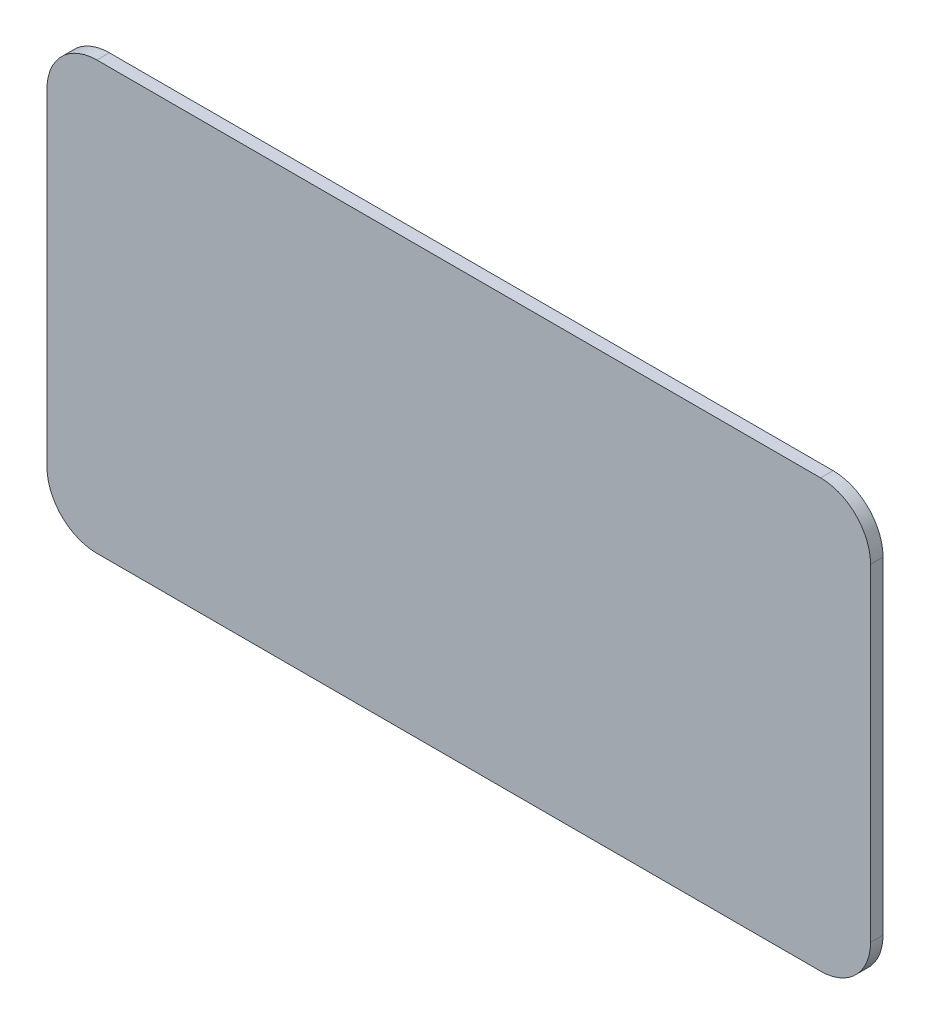
ISO-10303-21;
HEADER;
FILE_DESCRIPTION(('STEP AP214'),'2;1');
FILE_NAME('part.step','',(''),(''),'','','');
FILE_SCHEMA(('AUTOMOTIVE_DESIGN { 1 0 10303 214 1 1 1 1 }'));
ENDSEC;
DATA;
#1=APPLICATION_CONTEXT('core data for automotive mechanical design processes');
#2=APPLICATION_PROTOCOL_DEFINITION('international standard','automotive_design',2000,#1);
#3=PRODUCT_CONTEXT('',#1,'mechanical');
#4=PRODUCT('Part','Part','',(#3));
#5=PRODUCT_RELATED_PRODUCT_CATEGORY('part','',(#4));
#6=PRODUCT_DEFINITION_FORMATION('','',#4);
#7=PRODUCT_DEFINITION_CONTEXT('part definition',#1,'design');
#8=PRODUCT_DEFINITION('design','',#6,#7);
#9=PRODUCT_DEFINITION_SHAPE('','',#8);
#10=(LENGTH_UNIT() NAMED_UNIT(*) SI_UNIT(.MILLI.,.METRE.));
#11=(NAMED_UNIT(*) PLANE_ANGLE_UNIT() SI_UNIT($,.RADIAN.));
#12=(NAMED_UNIT(*) SI_UNIT($,.STERADIAN.) SOLID_ANGLE_UNIT());
#13=UNCERTAINTY_MEASURE_WITH_UNIT(LENGTH_MEASURE(1.E-05),#10,'distance_accuracy_value','');
#14=(GEOMETRIC_REPRESENTATION_CONTEXT(3) GLOBAL_UNCERTAINTY_ASSIGNED_CONTEXT((#13)) GLOBAL_UNIT_ASSIGNED_CONTEXT((#10,
#11,#12)) REPRESENTATION_CONTEXT('',''));
#15=CARTESIAN_POINT('',(0.,0.,0.));
#16=DIRECTION('',(0.,0.,1.));
#17=DIRECTION('',(1.,0.,0.));
#18=AXIS2_PLACEMENT_3D('',#15,#16,#17);
#19=CARTESIAN_POINT('',(0.,0.,6.35));
#20=DIRECTION('',(1.,0.,0.));
#21=DIRECTION('',(0.,1.,0.));
#22=AXIS2_PLACEMENT_3D('',#19,#20,#21);
#23=PLANE('',#22);
#24=DIRECTION('',(0.,-1.,0.));
#25=VECTOR('',#24,1.);
#26=CARTESIAN_POINT('',(0.,0.,0.));
#27=LINE('',#26,#25);
#28=CARTESIAN_POINT('',(0.,-25.4,0.));
#29=VERTEX_POINT('',#28);
#30=CARTESIAN_POINT('',(0.,-192.024,0.));
#31=VERTEX_POINT('',#30);
#32=EDGE_CURVE('E168',#29,#31,#27,.T.);
#33=ORIENTED_EDGE('',*,*,#32,.T.);
#34=DIRECTION('',(0.,0.,-1.));
#35=VECTOR('',#34,1.);
#36=CARTESIAN_POINT('',(0.,-192.024,6.35));
#37=LINE('',#36,#35);
#38=CARTESIAN_POINT('',(0.,-192.024,6.35));
#39=VERTEX_POINT('',#38);
#40=EDGE_CURVE('E146',#31,#39,#37,.F.);
#41=ORIENTED_EDGE('',*,*,#40,.T.);
#42=DIRECTION('',(0.,-1.,0.));
#43=VECTOR('',#42,1.);
#44=CARTESIAN_POINT('',(0.,0.,6.35));
#45=LINE('',#44,#43);
#46=CARTESIAN_POINT('',(0.,-25.4,6.35));
#47=VERTEX_POINT('',#46);
#48=EDGE_CURVE('E120',#47,#39,#45,.T.);
#49=ORIENTED_EDGE('',*,*,#48,.F.);
#50=DIRECTION('',(0.,0.,-1.));
#51=VECTOR('',#50,1.);
#52=CARTESIAN_POINT('',(0.,-25.4,6.35));
#53=LINE('',#52,#51);
#54=EDGE_CURVE('E133',#47,#29,#53,.T.);
#55=ORIENTED_EDGE('',*,*,#54,.T.);
#56=EDGE_LOOP('',(#33,#41,#49,#55));
#57=FACE_BOUND('',#56,.T.);
#58=ADVANCED_FACE('F33',(#57),#23,.F.);
#59=CARTESIAN_POINT('',(0.,-217.424,6.35));
#60=DIRECTION('',(0.,1.,0.));
#61=DIRECTION('',(0.,0.,1.));
#62=AXIS2_PLACEMENT_3D('',#59,#60,#61);
#63=PLANE('',#62);
#64=DIRECTION('',(1.,0.,0.));
#65=VECTOR('',#64,1.);
#66=CARTESIAN_POINT('',(0.,-217.424,0.));
#67=LINE('',#66,#65);
#68=CARTESIAN_POINT('',(25.4,-217.424,0.));
#69=VERTEX_POINT('',#68);
#70=CARTESIAN_POINT('',(393.7,-217.424,0.));
#71=VERTEX_POINT('',#70);
#72=EDGE_CURVE('E126',#69,#71,#67,.T.);
#73=ORIENTED_EDGE('',*,*,#72,.T.);
#74=DIRECTION('',(0.,0.,-1.));
#75=VECTOR('',#74,1.);
#76=CARTESIAN_POINT('',(393.7,-217.424,6.35));
#77=LINE('',#76,#75);
#78=CARTESIAN_POINT('',(393.7,-217.424,6.35));
#79=VERTEX_POINT('',#78);
#80=EDGE_CURVE('E41',#71,#79,#77,.F.);
#81=ORIENTED_EDGE('',*,*,#80,.T.);
#82=DIRECTION('',(1.,0.,0.));
#83=VECTOR('',#82,1.);
#84=CARTESIAN_POINT('',(0.,-217.424,6.35));
#85=LINE('',#84,#83);
#86=CARTESIAN_POINT('',(25.4,-217.424,6.35));
#87=VERTEX_POINT('',#86);
#88=EDGE_CURVE('E124',#87,#79,#85,.T.);
#89=ORIENTED_EDGE('',*,*,#88,.F.);
#90=DIRECTION('',(0.,0.,-1.));
#91=VECTOR('',#90,1.);
#92=CARTESIAN_POINT('',(25.4,-217.424,6.35));
#93=LINE('',#92,#91);
#94=EDGE_CURVE('E141',#87,#69,#93,.T.);
#95=ORIENTED_EDGE('',*,*,#94,.T.);
#96=EDGE_LOOP('',(#73,#81,#89,#95));
#97=FACE_BOUND('',#96,.T.);
#98=ADVANCED_FACE('F170',(#97),#63,.F.);
#99=CARTESIAN_POINT('',(419.1,0.,6.35));
#100=DIRECTION('',(-1.,0.,0.));
#101=DIRECTION('',(0.,0.,1.));
#102=AXIS2_PLACEMENT_3D('',#99,#100,#101);
#103=PLANE('',#102);
#104=DIRECTION('',(0.,1.,0.));
#105=VECTOR('',#104,1.);
#106=CARTESIAN_POINT('',(419.1,0.,6.35));
#107=LINE('',#106,#105);
#108=CARTESIAN_POINT('',(419.1,-192.024,6.35));
#109=VERTEX_POINT('',#108);
#110=CARTESIAN_POINT('',(419.1,-25.4,6.35));
#111=VERTEX_POINT('',#110);
#112=EDGE_CURVE('E157',#109,#111,#107,.T.);
#113=ORIENTED_EDGE('',*,*,#112,.F.);
#114=DIRECTION('',(0.,0.,-1.));
#115=VECTOR('',#114,1.);
#116=CARTESIAN_POINT('',(419.1,-192.024,6.35));
#117=LINE('',#116,#115);
#118=CARTESIAN_POINT('',(419.1,-192.024,0.));
#119=VERTEX_POINT('',#118);
#120=EDGE_CURVE('E150',#109,#119,#117,.T.);
#121=ORIENTED_EDGE('',*,*,#120,.T.);
#122=DIRECTION('',(0.,1.,0.));
#123=VECTOR('',#122,1.);
#124=CARTESIAN_POINT('',(419.1,0.,0.));
#125=LINE('',#124,#123);
#126=CARTESIAN_POINT('',(419.1,-25.4,0.));
#127=VERTEX_POINT('',#126);
#128=EDGE_CURVE('E121',#119,#127,#125,.T.);
#129=ORIENTED_EDGE('',*,*,#128,.T.);
#130=DIRECTION('',(0.,0.,-1.));
#131=VECTOR('',#130,1.);
#132=CARTESIAN_POINT('',(419.1,-25.4,6.35));
#133=LINE('',#132,#131);
#134=EDGE_CURVE('E105',#127,#111,#133,.F.);
#135=ORIENTED_EDGE('',*,*,#134,.T.);
#136=EDGE_LOOP('',(#113,#121,#129,#135));
#137=FACE_BOUND('',#136,.T.);
#138=ADVANCED_FACE('F156',(#137),#103,.F.);
#139=CARTESIAN_POINT('',(0.,0.,6.35));
#140=DIRECTION('',(0.,-1.,0.));
#141=DIRECTION('',(0.,0.,-1.));
#142=AXIS2_PLACEMENT_3D('',#139,#140,#141);
#143=PLANE('',#142);
#144=DIRECTION('',(-1.,0.,0.));
#145=VECTOR('',#144,1.);
#146=CARTESIAN_POINT('',(0.,0.,0.));
#147=LINE('',#146,#145);
#148=CARTESIAN_POINT('',(393.7,0.,0.));
#149=VERTEX_POINT('',#148);
#150=CARTESIAN_POINT('',(25.4,0.,0.));
#151=VERTEX_POINT('',#150);
#152=EDGE_CURVE('E112',#149,#151,#147,.T.);
#153=ORIENTED_EDGE('',*,*,#152,.T.);
#154=DIRECTION('',(0.,0.,-1.));
#155=VECTOR('',#154,1.);
#156=CARTESIAN_POINT('',(25.4,0.,6.35));
#157=LINE('',#156,#155);
#158=CARTESIAN_POINT('',(25.4,0.,6.35));
#159=VERTEX_POINT('',#158);
#160=EDGE_CURVE('E137',#151,#159,#157,.F.);
#161=ORIENTED_EDGE('',*,*,#160,.T.);
#162=DIRECTION('',(-1.,0.,0.));
#163=VECTOR('',#162,1.);
#164=CARTESIAN_POINT('',(0.,0.,6.35));
#165=LINE('',#164,#163);
#166=CARTESIAN_POINT('',(393.7,0.,6.35));
#167=VERTEX_POINT('',#166);
#168=EDGE_CURVE('E115',#167,#159,#165,.T.);
#169=ORIENTED_EDGE('',*,*,#168,.F.);
#170=DIRECTION('',(0.,0.,-1.));
#171=VECTOR('',#170,1.);
#172=CARTESIAN_POINT('',(393.7,0.,6.35));
#173=LINE('',#172,#171);
#174=EDGE_CURVE('E103',#167,#149,#173,.T.);
#175=ORIENTED_EDGE('',*,*,#174,.T.);
#176=EDGE_LOOP('',(#153,#161,#169,#175));
#177=FACE_BOUND('',#176,.T.);
#178=ADVANCED_FACE('F111',(#177),#143,.F.);
#179=CARTESIAN_POINT('',(0.,0.,6.35));
#180=DIRECTION('',(0.,0.,1.));
#181=DIRECTION('',(1.,0.,0.));
#182=AXIS2_PLACEMENT_3D('',#179,#180,#181);
#183=PLANE('',#182);
#184=ORIENTED_EDGE('',*,*,#88,.T.);
#185=CARTESIAN_POINT('',(393.7,-192.024,6.35));
#186=DIRECTION('',(0.,0.,1.));
#187=DIRECTION('',(1.,0.,0.));
#188=AXIS2_PLACEMENT_3D('',#185,#186,#187);
#189=CIRCLE('',#188,25.4);
#190=EDGE_CURVE('E11',#79,#109,#189,.T.);
#191=ORIENTED_EDGE('',*,*,#190,.T.);
#192=ORIENTED_EDGE('',*,*,#112,.T.);
#193=CARTESIAN_POINT('',(393.7,-25.4,6.35));
#194=DIRECTION('',(0.,0.,1.));
#195=DIRECTION('',(1.,0.,0.));
#196=AXIS2_PLACEMENT_3D('',#193,#194,#195);
#197=CIRCLE('',#196,25.4);
#198=EDGE_CURVE('E131',#111,#167,#197,.T.);
#199=ORIENTED_EDGE('',*,*,#198,.T.);
#200=ORIENTED_EDGE('',*,*,#168,.T.);
#201=CARTESIAN_POINT('',(25.4,-25.4,6.35));
#202=DIRECTION('',(0.,0.,1.));
#203=DIRECTION('',(1.,0.,0.));
#204=AXIS2_PLACEMENT_3D('',#201,#202,#203);
#205=CIRCLE('',#204,25.4);
#206=EDGE_CURVE('E139',#159,#47,#205,.T.);
#207=ORIENTED_EDGE('',*,*,#206,.T.);
#208=ORIENTED_EDGE('',*,*,#48,.T.);
#209=CARTESIAN_POINT('',(25.4,-192.024,6.35));
#210=DIRECTION('',(0.,0.,1.));
#211=DIRECTION('',(1.,0.,0.));
#212=AXIS2_PLACEMENT_3D('',#209,#210,#211);
#213=CIRCLE('',#212,25.4);
#214=EDGE_CURVE('E148',#39,#87,#213,.T.);
#215=ORIENTED_EDGE('',*,*,#214,.T.);
#216=EDGE_LOOP('',(#184,#191,#192,#199,#200,#207,#208,#215));
#217=FACE_BOUND('',#216,.T.);
#218=ADVANCED_FACE('F161',(#217),#183,.T.);
#219=CARTESIAN_POINT('',(0.,0.,0.));
#220=DIRECTION('',(0.,0.,1.));
#221=DIRECTION('',(1.,0.,0.));
#222=AXIS2_PLACEMENT_3D('',#219,#220,#221);
#223=PLANE('',#222);
#224=ORIENTED_EDGE('',*,*,#128,.F.);
#225=CARTESIAN_POINT('',(393.7,-192.024,0.));
#226=DIRECTION('',(0.,0.,1.));
#227=DIRECTION('',(1.,0.,0.));
#228=AXIS2_PLACEMENT_3D('',#225,#226,#227);
#229=CIRCLE('',#228,25.4);
#230=EDGE_CURVE('E55',#119,#71,#229,.F.);
#231=ORIENTED_EDGE('',*,*,#230,.T.);
#232=ORIENTED_EDGE('',*,*,#72,.F.);
#233=CARTESIAN_POINT('',(25.4,-192.024,0.));
#234=DIRECTION('',(0.,0.,1.));
#235=DIRECTION('',(1.,0.,0.));
#236=AXIS2_PLACEMENT_3D('',#233,#234,#235);
#237=CIRCLE('',#236,25.4);
#238=EDGE_CURVE('E144',#69,#31,#237,.F.);
#239=ORIENTED_EDGE('',*,*,#238,.T.);
#240=ORIENTED_EDGE('',*,*,#32,.F.);
#241=CARTESIAN_POINT('',(25.4,-25.4,0.));
#242=DIRECTION('',(0.,0.,1.));
#243=DIRECTION('',(1.,0.,0.));
#244=AXIS2_PLACEMENT_3D('',#241,#242,#243);
#245=CIRCLE('',#244,25.4);
#246=EDGE_CURVE('E119',#29,#151,#245,.F.);
#247=ORIENTED_EDGE('',*,*,#246,.T.);
#248=ORIENTED_EDGE('',*,*,#152,.F.);
#249=CARTESIAN_POINT('',(393.7,-25.4,0.));
#250=DIRECTION('',(0.,0.,1.));
#251=DIRECTION('',(1.,0.,0.));
#252=AXIS2_PLACEMENT_3D('',#249,#250,#251);
#253=CIRCLE('',#252,25.4);
#254=EDGE_CURVE('E99',#149,#127,#253,.F.);
#255=ORIENTED_EDGE('',*,*,#254,.T.);
#256=EDGE_LOOP('',(#224,#231,#232,#239,#240,#247,#248,#255));
#257=FACE_BOUND('',#256,.T.);
#258=ADVANCED_FACE('F117',(#257),#223,.F.);
#259=CARTESIAN_POINT('',(393.7,-25.4,6.35));
#260=DIRECTION('',(0.,0.,-1.));
#261=DIRECTION('',(-1.,0.,0.));
#262=AXIS2_PLACEMENT_3D('',#259,#260,#261);
#263=CYLINDRICAL_SURFACE('',#262,25.4);
#264=ORIENTED_EDGE('',*,*,#198,.F.);
#265=ORIENTED_EDGE('',*,*,#134,.F.);
#266=ORIENTED_EDGE('',*,*,#254,.F.);
#267=ORIENTED_EDGE('',*,*,#174,.F.);
#268=EDGE_LOOP('',(#264,#265,#266,#267));
#269=FACE_BOUND('',#268,.T.);
#270=ADVANCED_FACE('F102',(#269),#263,.T.);
#271=CARTESIAN_POINT('',(25.4,-25.4,6.35));
#272=DIRECTION('',(0.,0.,-1.));
#273=DIRECTION('',(-1.,0.,0.));
#274=AXIS2_PLACEMENT_3D('',#271,#272,#273);
#275=CYLINDRICAL_SURFACE('',#274,25.4);
#276=ORIENTED_EDGE('',*,*,#206,.F.);
#277=ORIENTED_EDGE('',*,*,#160,.F.);
#278=ORIENTED_EDGE('',*,*,#246,.F.);
#279=ORIENTED_EDGE('',*,*,#54,.F.);
#280=EDGE_LOOP('',(#276,#277,#278,#279));
#281=FACE_BOUND('',#280,.T.);
#282=ADVANCED_FACE('F178',(#281),#275,.T.);
#283=CARTESIAN_POINT('',(25.4,-192.024,6.35));
#284=DIRECTION('',(0.,0.,-1.));
#285=DIRECTION('',(-1.,0.,0.));
#286=AXIS2_PLACEMENT_3D('',#283,#284,#285);
#287=CYLINDRICAL_SURFACE('',#286,25.4);
#288=ORIENTED_EDGE('',*,*,#214,.F.);
#289=ORIENTED_EDGE('',*,*,#40,.F.);
#290=ORIENTED_EDGE('',*,*,#238,.F.);
#291=ORIENTED_EDGE('',*,*,#94,.F.);
#292=EDGE_LOOP('',(#288,#289,#290,#291));
#293=FACE_BOUND('',#292,.T.);
#294=ADVANCED_FACE('F176',(#293),#287,.T.);
#295=CARTESIAN_POINT('',(393.7,-192.024,6.35));
#296=DIRECTION('',(0.,0.,-1.));
#297=DIRECTION('',(-1.,0.,0.));
#298=AXIS2_PLACEMENT_3D('',#295,#296,#297);
#299=CYLINDRICAL_SURFACE('',#298,25.4);
#300=ORIENTED_EDGE('',*,*,#190,.F.);
#301=ORIENTED_EDGE('',*,*,#80,.F.);
#302=ORIENTED_EDGE('',*,*,#230,.F.);
#303=ORIENTED_EDGE('',*,*,#120,.F.);
#304=EDGE_LOOP('',(#300,#301,#302,#303));
#305=FACE_BOUND('',#304,.T.);
#306=ADVANCED_FACE('F35',(#305),#299,.T.);
#307=CLOSED_SHELL('',(#58,#98,#138,#178,#218,#258,#270,#282,#294,#306));
#308=MANIFOLD_SOLID_BREP('B2',#307);
#309=ADVANCED_BREP_SHAPE_REPRESENTATION('',(#18,#308),#14);
#310=SHAPE_DEFINITION_REPRESENTATION(#9,#309);
ENDSEC;
END-ISO-10303-21;
